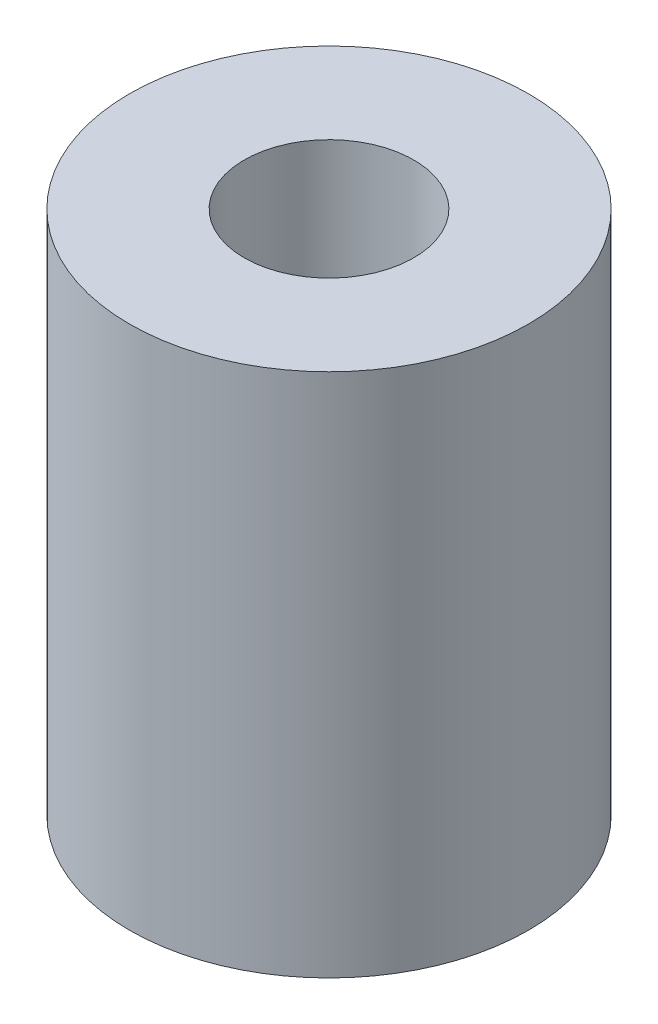
ISO-10303-21;
HEADER;
FILE_DESCRIPTION(('STEP AP214'),'2;1');
FILE_NAME('part.step','',(''),(''),'','','');
FILE_SCHEMA(('AUTOMOTIVE_DESIGN { 1 0 10303 214 1 1 1 1 }'));
ENDSEC;
DATA;
#1=APPLICATION_CONTEXT('core data for automotive mechanical design processes');
#2=APPLICATION_PROTOCOL_DEFINITION('international standard','automotive_design',2000,#1);
#3=PRODUCT_CONTEXT('',#1,'mechanical');
#4=PRODUCT('Part','Part','',(#3));
#5=PRODUCT_RELATED_PRODUCT_CATEGORY('part','',(#4));
#6=PRODUCT_DEFINITION_FORMATION('','',#4);
#7=PRODUCT_DEFINITION_CONTEXT('part definition',#1,'design');
#8=PRODUCT_DEFINITION('design','',#6,#7);
#9=PRODUCT_DEFINITION_SHAPE('','',#8);
#10=(LENGTH_UNIT() NAMED_UNIT(*) SI_UNIT(.MILLI.,.METRE.));
#11=(NAMED_UNIT(*) PLANE_ANGLE_UNIT() SI_UNIT($,.RADIAN.));
#12=(NAMED_UNIT(*) SI_UNIT($,.STERADIAN.) SOLID_ANGLE_UNIT());
#13=UNCERTAINTY_MEASURE_WITH_UNIT(LENGTH_MEASURE(1.E-05),#10,'distance_accuracy_value','');
#14=(GEOMETRIC_REPRESENTATION_CONTEXT(3) GLOBAL_UNCERTAINTY_ASSIGNED_CONTEXT((#13)) GLOBAL_UNIT_ASSIGNED_CONTEXT((#10,
#11,#12)) REPRESENTATION_CONTEXT('',''));
#15=CARTESIAN_POINT('',(0.,0.,0.));
#16=DIRECTION('',(0.,0.,1.));
#17=DIRECTION('',(1.,0.,0.));
#18=AXIS2_PLACEMENT_3D('',#15,#16,#17);
#19=CARTESIAN_POINT('',(0.,24.765,0.));
#20=DIRECTION('',(0.,-1.,0.));
#21=DIRECTION('',(0.,0.,-1.));
#22=AXIS2_PLACEMENT_3D('',#19,#20,#21);
#23=CYLINDRICAL_SURFACE('',#22,2.5);
#24=CARTESIAN_POINT('',(0.,0.,0.));
#25=DIRECTION('',(0.,1.,0.));
#26=DIRECTION('',(0.,0.,1.));
#27=AXIS2_PLACEMENT_3D('',#24,#25,#26);
#28=CIRCLE('',#27,2.5);
#29=CARTESIAN_POINT('',(0.,0.,2.5));
#30=VERTEX_POINT('',#29);
#31=EDGE_CURVE('E58',#30,#30,#28,.T.);
#32=ORIENTED_EDGE('',*,*,#31,.F.);
#33=EDGE_LOOP('',(#32));
#34=FACE_BOUND('',#33,.T.);
#35=CARTESIAN_POINT('',(0.,12.065,0.));
#36=DIRECTION('',(0.,1.,0.));
#37=DIRECTION('',(0.,0.,1.));
#38=AXIS2_PLACEMENT_3D('',#35,#36,#37);
#39=CIRCLE('',#38,2.5);
#40=CARTESIAN_POINT('',(0.,12.065,2.5));
#41=VERTEX_POINT('',#40);
#42=EDGE_CURVE('E47',#41,#41,#39,.T.);
#43=ORIENTED_EDGE('',*,*,#42,.T.);
#44=EDGE_LOOP('',(#43));
#45=FACE_BOUND('',#44,.T.);
#46=ADVANCED_FACE('F43',(#34,#45),#23,.F.);
#47=CARTESIAN_POINT('',(0.,24.765,0.));
#48=DIRECTION('',(0.,1.,0.));
#49=DIRECTION('',(0.,0.,1.));
#50=AXIS2_PLACEMENT_3D('',#47,#48,#49);
#51=PLANE('',#50);
#52=CARTESIAN_POINT('',(0.,24.765,0.));
#53=DIRECTION('',(0.,1.,0.));
#54=DIRECTION('',(0.,0.,1.));
#55=AXIS2_PLACEMENT_3D('',#52,#53,#54);
#56=CIRCLE('',#55,4.);
#57=CARTESIAN_POINT('',(0.,24.765,4.));
#58=VERTEX_POINT('',#57);
#59=EDGE_CURVE('E63',#58,#58,#56,.T.);
#60=ORIENTED_EDGE('',*,*,#59,.F.);
#61=EDGE_LOOP('',(#60));
#62=FACE_BOUND('',#61,.T.);
#63=CARTESIAN_POINT('',(0.,24.765,0.));
#64=DIRECTION('',(0.,1.,0.));
#65=DIRECTION('',(0.,0.,1.));
#66=AXIS2_PLACEMENT_3D('',#63,#64,#65);
#67=CIRCLE('',#66,9.4107);
#68=CARTESIAN_POINT('',(0.,24.765,9.4107));
#69=VERTEX_POINT('',#68);
#70=EDGE_CURVE('E10',#69,#69,#67,.T.);
#71=ORIENTED_EDGE('',*,*,#70,.T.);
#72=EDGE_LOOP('',(#71));
#73=FACE_BOUND('',#72,.T.);
#74=ADVANCED_FACE('F87',(#62,#73),#51,.T.);
#75=CARTESIAN_POINT('',(0.,0.,0.));
#76=DIRECTION('',(0.,1.,0.));
#77=DIRECTION('',(0.,0.,1.));
#78=AXIS2_PLACEMENT_3D('',#75,#76,#77);
#79=PLANE('',#78);
#80=CARTESIAN_POINT('',(0.,0.,0.));
#81=DIRECTION('',(0.,1.,0.));
#82=DIRECTION('',(0.,0.,1.));
#83=AXIS2_PLACEMENT_3D('',#80,#81,#82);
#84=CIRCLE('',#83,9.4107);
#85=CARTESIAN_POINT('',(0.,0.,9.4107));
#86=VERTEX_POINT('',#85);
#87=EDGE_CURVE('E52',#86,#86,#84,.T.);
#88=ORIENTED_EDGE('',*,*,#87,.F.);
#89=EDGE_LOOP('',(#88));
#90=FACE_BOUND('',#89,.T.);
#91=ORIENTED_EDGE('',*,*,#31,.T.);
#92=EDGE_LOOP('',(#91));
#93=FACE_BOUND('',#92,.T.);
#94=ADVANCED_FACE('F94',(#90,#93),#79,.F.);
#95=CARTESIAN_POINT('',(0.,24.765,0.));
#96=DIRECTION('',(0.,-1.,0.));
#97=DIRECTION('',(0.,0.,-1.));
#98=AXIS2_PLACEMENT_3D('',#95,#96,#97);
#99=CYLINDRICAL_SURFACE('',#98,9.4107);
#100=ORIENTED_EDGE('',*,*,#70,.F.);
#101=EDGE_LOOP('',(#100));
#102=FACE_BOUND('',#101,.T.);
#103=ORIENTED_EDGE('',*,*,#87,.T.);
#104=EDGE_LOOP('',(#103));
#105=FACE_BOUND('',#104,.T.);
#106=ADVANCED_FACE('F45',(#102,#105),#99,.T.);
#107=CARTESIAN_POINT('',(0.,12.065,0.));
#108=DIRECTION('',(0.,1.,0.));
#109=DIRECTION('',(0.,0.,1.));
#110=AXIS2_PLACEMENT_3D('',#107,#108,#109);
#111=CYLINDRICAL_SURFACE('',#110,4.);
#112=CARTESIAN_POINT('',(0.,12.065,0.));
#113=DIRECTION('',(0.,1.,0.));
#114=DIRECTION('',(0.,0.,1.));
#115=AXIS2_PLACEMENT_3D('',#112,#113,#114);
#116=CIRCLE('',#115,4.);
#117=CARTESIAN_POINT('',(0.,12.065,4.));
#118=VERTEX_POINT('',#117);
#119=EDGE_CURVE('E67',#118,#118,#116,.T.);
#120=ORIENTED_EDGE('',*,*,#119,.F.);
#121=EDGE_LOOP('',(#120));
#122=FACE_BOUND('',#121,.T.);
#123=ORIENTED_EDGE('',*,*,#59,.T.);
#124=EDGE_LOOP('',(#123));
#125=FACE_BOUND('',#124,.T.);
#126=ADVANCED_FACE('F79',(#122,#125),#111,.F.);
#127=CARTESIAN_POINT('',(0.,12.065,0.));
#128=DIRECTION('',(0.,1.,0.));
#129=DIRECTION('',(0.,0.,1.));
#130=AXIS2_PLACEMENT_3D('',#127,#128,#129);
#131=PLANE('',#130);
#132=ORIENTED_EDGE('',*,*,#42,.F.);
#133=EDGE_LOOP('',(#132));
#134=FACE_BOUND('',#133,.T.);
#135=ORIENTED_EDGE('',*,*,#119,.T.);
#136=EDGE_LOOP('',(#135));
#137=FACE_BOUND('',#136,.T.);
#138=ADVANCED_FACE('F77',(#134,#137),#131,.T.);
#139=CLOSED_SHELL('',(#46,#74,#94,#106,#126,#138));
#140=MANIFOLD_SOLID_BREP('B2',#139);
#141=ADVANCED_BREP_SHAPE_REPRESENTATION('',(#18,#140),#14);
#142=SHAPE_DEFINITION_REPRESENTATION(#9,#141);
ENDSEC;
END-ISO-10303-21;
